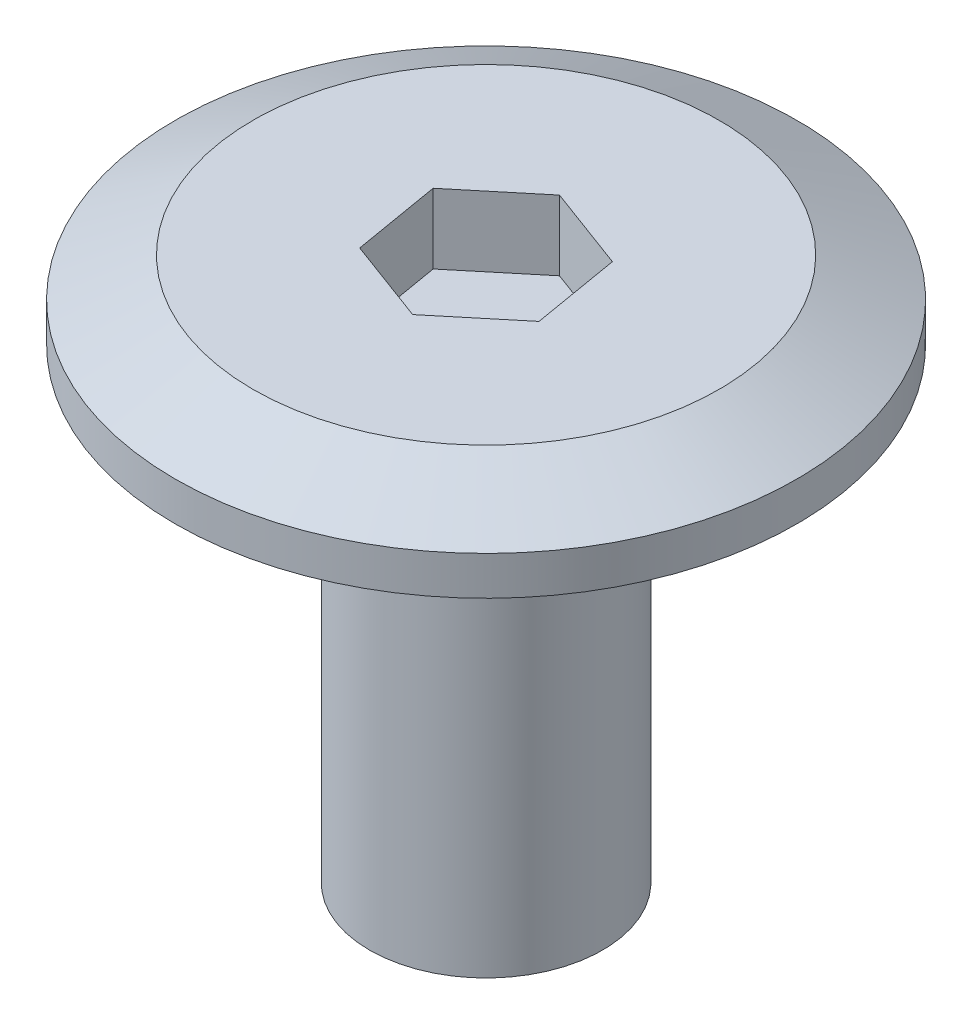
ISO-10303-21;
HEADER;
FILE_DESCRIPTION(('STEP AP214'),'2;1');
FILE_NAME('part.step','',(''),(''),'','','');
FILE_SCHEMA(('AUTOMOTIVE_DESIGN { 1 0 10303 214 1 1 1 1 }'));
ENDSEC;
DATA;
#1=APPLICATION_CONTEXT('core data for automotive mechanical design processes');
#2=APPLICATION_PROTOCOL_DEFINITION('international standard','automotive_design',2000,#1);
#3=PRODUCT_CONTEXT('',#1,'mechanical');
#4=PRODUCT('Part','Part','',(#3));
#5=PRODUCT_RELATED_PRODUCT_CATEGORY('part','',(#4));
#6=PRODUCT_DEFINITION_FORMATION('','',#4);
#7=PRODUCT_DEFINITION_CONTEXT('part definition',#1,'design');
#8=PRODUCT_DEFINITION('design','',#6,#7);
#9=PRODUCT_DEFINITION_SHAPE('','',#8);
#10=(LENGTH_UNIT() NAMED_UNIT(*) SI_UNIT(.MILLI.,.METRE.));
#11=(NAMED_UNIT(*) PLANE_ANGLE_UNIT() SI_UNIT($,.RADIAN.));
#12=(NAMED_UNIT(*) SI_UNIT($,.STERADIAN.) SOLID_ANGLE_UNIT());
#13=UNCERTAINTY_MEASURE_WITH_UNIT(LENGTH_MEASURE(1.E-05),#10,'distance_accuracy_value','');
#14=(GEOMETRIC_REPRESENTATION_CONTEXT(3) GLOBAL_UNCERTAINTY_ASSIGNED_CONTEXT((#13)) GLOBAL_UNIT_ASSIGNED_CONTEXT((#10,
#11,#12)) REPRESENTATION_CONTEXT('',''));
#15=CARTESIAN_POINT('',(0.,0.,0.));
#16=DIRECTION('',(0.,0.,1.));
#17=DIRECTION('',(1.,0.,0.));
#18=AXIS2_PLACEMENT_3D('',#15,#16,#17);
#19=CARTESIAN_POINT('',(0.,0.,0.));
#20=DIRECTION('',(0.,1.,0.));
#21=DIRECTION('',(0.,0.,1.));
#22=AXIS2_PLACEMENT_3D('',#19,#20,#21);
#23=PLANE('',#22);
#24=CARTESIAN_POINT('',(0.,0.,0.));
#25=DIRECTION('',(0.,1.,0.));
#26=DIRECTION('',(0.,0.,1.));
#27=AXIS2_PLACEMENT_3D('',#24,#25,#26);
#28=CIRCLE('',#27,4.);
#29=CARTESIAN_POINT('',(0.,0.,4.));
#30=VERTEX_POINT('',#29);
#31=EDGE_CURVE('E135',#30,#30,#28,.T.);
#32=ORIENTED_EDGE('',*,*,#31,.F.);
#33=EDGE_LOOP('',(#32));
#34=FACE_BOUND('',#33,.T.);
#35=CARTESIAN_POINT('',(0.,0.,0.));
#36=DIRECTION('',(0.,1.,0.));
#37=DIRECTION('',(0.,0.,1.));
#38=AXIS2_PLACEMENT_3D('',#35,#36,#37);
#39=CIRCLE('',#38,1.5);
#40=CARTESIAN_POINT('',(0.,0.,1.5));
#41=VERTEX_POINT('',#40);
#42=EDGE_CURVE('E11',#41,#41,#39,.F.);
#43=ORIENTED_EDGE('',*,*,#42,.F.);
#44=EDGE_LOOP('',(#43));
#45=FACE_BOUND('',#44,.T.);
#46=ADVANCED_FACE('F32',(#34,#45),#23,.F.);
#47=CARTESIAN_POINT('',(0.,1.,0.));
#48=DIRECTION('',(0.,-1.,0.));
#49=DIRECTION('',(0.,0.,-1.));
#50=AXIS2_PLACEMENT_3D('',#47,#48,#49);
#51=CYLINDRICAL_SURFACE('',#50,4.);
#52=CARTESIAN_POINT('',(0.,0.5,0.));
#53=DIRECTION('',(0.,1.,0.));
#54=DIRECTION('',(0.,0.,1.));
#55=AXIS2_PLACEMENT_3D('',#52,#53,#54);
#56=CIRCLE('',#55,4.);
#57=CARTESIAN_POINT('',(0.,0.5,4.));
#58=VERTEX_POINT('',#57);
#59=EDGE_CURVE('E40',#58,#58,#56,.F.);
#60=ORIENTED_EDGE('',*,*,#59,.T.);
#61=EDGE_LOOP('',(#60));
#62=FACE_BOUND('',#61,.T.);
#63=ORIENTED_EDGE('',*,*,#31,.T.);
#64=EDGE_LOOP('',(#63));
#65=FACE_BOUND('',#64,.T.);
#66=ADVANCED_FACE('F148',(#62,#65),#51,.T.);
#67=CARTESIAN_POINT('',(0.,1.,0.));
#68=DIRECTION('',(0.,1.,0.));
#69=DIRECTION('',(0.,0.,1.));
#70=AXIS2_PLACEMENT_3D('',#67,#68,#69);
#71=PLANE('',#70);
#72=DIRECTION('',(-0.167674640500967,0.,-0.985842388484524));
#73=VECTOR('',#72,1.);
#74=CARTESIAN_POINT('',(1.08264938731403,1.,0.401501727869117));
#75=LINE('',#74,#73);
#76=CARTESIAN_POINT('',(1.08264938731403,1.,0.401501727869117));
#77=VERTEX_POINT('',#76);
#78=CARTESIAN_POINT('',(0.889035389655017,1.,-0.73685100887105));
#79=VERTEX_POINT('',#78);
#80=EDGE_CURVE('E47',#77,#79,#75,.T.);
#81=ORIENTED_EDGE('',*,*,#80,.F.);
#82=DIRECTION('',(0.769927232304642,0.,-0.638131692486523));
#83=VECTOR('',#82,1.);
#84=CARTESIAN_POINT('',(0.193613997659014,1.,1.13835273674017));
#85=LINE('',#84,#83);
#86=CARTESIAN_POINT('',(0.193613997659014,1.,1.13835273674017));
#87=VERTEX_POINT('',#86);
#88=EDGE_CURVE('E131',#87,#77,#85,.T.);
#89=ORIENTED_EDGE('',*,*,#88,.F.);
#90=DIRECTION('',(0.937601872805609,0.,0.347710695998002));
#91=VECTOR('',#90,1.);
#92=CARTESIAN_POINT('',(-0.889035389655016,1.,0.736851008871051));
#93=LINE('',#92,#91);
#94=CARTESIAN_POINT('',(-0.889035389655016,1.,0.736851008871051));
#95=VERTEX_POINT('',#94);
#96=EDGE_CURVE('E129',#95,#87,#93,.T.);
#97=ORIENTED_EDGE('',*,*,#96,.F.);
#98=DIRECTION('',(0.167674640500967,0.,0.985842388484524));
#99=VECTOR('',#98,1.);
#100=CARTESIAN_POINT('',(-1.08264938731403,1.,-0.401501727869116));
#101=LINE('',#100,#99);
#102=CARTESIAN_POINT('',(-1.08264938731403,1.,-0.401501727869116));
#103=VERTEX_POINT('',#102);
#104=EDGE_CURVE('E95',#103,#95,#101,.T.);
#105=ORIENTED_EDGE('',*,*,#104,.F.);
#106=DIRECTION('',(-0.769927232304642,0.,0.638131692486523));
#107=VECTOR('',#106,1.);
#108=CARTESIAN_POINT('',(-0.193613997659014,1.,-1.13835273674017));
#109=LINE('',#108,#107);
#110=CARTESIAN_POINT('',(-0.193613997659014,1.,-1.13835273674017));
#111=VERTEX_POINT('',#110);
#112=EDGE_CURVE('E125',#111,#103,#109,.T.);
#113=ORIENTED_EDGE('',*,*,#112,.F.);
#114=DIRECTION('',(-0.937601872805609,0.,-0.347710695998002));
#115=VECTOR('',#114,1.);
#116=CARTESIAN_POINT('',(0.889035389655017,1.,-0.73685100887105));
#117=LINE('',#116,#115);
#118=EDGE_CURVE('E121',#79,#111,#117,.T.);
#119=ORIENTED_EDGE('',*,*,#118,.F.);
#120=EDGE_LOOP('',(#81,#89,#97,#105,#113,#119));
#121=FACE_BOUND('',#120,.T.);
#122=CARTESIAN_POINT('',(0.,1.,0.));
#123=DIRECTION('',(0.,1.,0.));
#124=DIRECTION('',(0.,0.,1.));
#125=AXIS2_PLACEMENT_3D('',#122,#123,#124);
#126=CIRCLE('',#125,2.99999999999999);
#127=CARTESIAN_POINT('',(0.,1.,2.99999999999999));
#128=VERTEX_POINT('',#127);
#129=EDGE_CURVE('E143',#128,#128,#126,.T.);
#130=ORIENTED_EDGE('',*,*,#129,.T.);
#131=EDGE_LOOP('',(#130));
#132=FACE_BOUND('',#131,.T.);
#133=ADVANCED_FACE('F154',(#121,#132),#71,.T.);
#134=CARTESIAN_POINT('',(0.,1.,0.));
#135=DIRECTION('',(0.,-1.,0.));
#136=DIRECTION('',(0.,0.,-1.));
#137=AXIS2_PLACEMENT_3D('',#134,#135,#136);
#138=CONICAL_SURFACE('',#137,2.99999999999999,1.10714871779409);
#139=ORIENTED_EDGE('',*,*,#59,.F.);
#140=EDGE_LOOP('',(#139));
#141=FACE_BOUND('',#140,.T.);
#142=ORIENTED_EDGE('',*,*,#129,.F.);
#143=EDGE_LOOP('',(#142));
#144=FACE_BOUND('',#143,.T.);
#145=ADVANCED_FACE('F34',(#141,#144),#138,.T.);
#146=CARTESIAN_POINT('',(1.08264938731403,0.1,0.401501727869117));
#147=DIRECTION('',(0.985842388484524,0.,-0.167674640500967));
#148=DIRECTION('',(-0.167674640500967,0.,-0.985842388484524));
#149=AXIS2_PLACEMENT_3D('',#146,#147,#148);
#150=PLANE('',#149);
#151=ORIENTED_EDGE('',*,*,#80,.T.);
#152=DIRECTION('',(0.,1.,0.));
#153=VECTOR('',#152,1.);
#154=CARTESIAN_POINT('',(0.889035389655017,0.1,-0.73685100887105));
#155=LINE('',#154,#153);
#156=CARTESIAN_POINT('',(0.889035389655017,0.1,-0.73685100887105));
#157=VERTEX_POINT('',#156);
#158=EDGE_CURVE('E77',#157,#79,#155,.T.);
#159=ORIENTED_EDGE('',*,*,#158,.F.);
#160=DIRECTION('',(-0.167674640500967,0.,-0.985842388484524));
#161=VECTOR('',#160,1.);
#162=CARTESIAN_POINT('',(1.08264938731403,0.1,0.401501727869117));
#163=LINE('',#162,#161);
#164=CARTESIAN_POINT('',(1.08264938731403,0.1,0.401501727869117));
#165=VERTEX_POINT('',#164);
#166=EDGE_CURVE('E133',#165,#157,#163,.T.);
#167=ORIENTED_EDGE('',*,*,#166,.F.);
#168=DIRECTION('',(0.,1.,0.));
#169=VECTOR('',#168,1.);
#170=CARTESIAN_POINT('',(1.08264938731403,0.1,0.401501727869117));
#171=LINE('',#170,#169);
#172=EDGE_CURVE('E55',#165,#77,#171,.T.);
#173=ORIENTED_EDGE('',*,*,#172,.T.);
#174=EDGE_LOOP('',(#151,#159,#167,#173));
#175=FACE_BOUND('',#174,.T.);
#176=ADVANCED_FACE('F153',(#175),#150,.F.);
#177=CARTESIAN_POINT('',(0.193613997659014,0.1,1.13835273674017));
#178=DIRECTION('',(0.638131692486523,0.,0.769927232304642));
#179=DIRECTION('',(0.769927232304642,0.,-0.638131692486523));
#180=AXIS2_PLACEMENT_3D('',#177,#178,#179);
#181=PLANE('',#180);
#182=ORIENTED_EDGE('',*,*,#88,.T.);
#183=ORIENTED_EDGE('',*,*,#172,.F.);
#184=DIRECTION('',(0.769927232304642,0.,-0.638131692486523));
#185=VECTOR('',#184,1.);
#186=CARTESIAN_POINT('',(0.193613997659014,0.1,1.13835273674017));
#187=LINE('',#186,#185);
#188=CARTESIAN_POINT('',(0.193613997659014,0.1,1.13835273674017));
#189=VERTEX_POINT('',#188);
#190=EDGE_CURVE('E107',#189,#165,#187,.T.);
#191=ORIENTED_EDGE('',*,*,#190,.F.);
#192=DIRECTION('',(0.,1.,0.));
#193=VECTOR('',#192,1.);
#194=CARTESIAN_POINT('',(0.193613997659014,0.1,1.13835273674017));
#195=LINE('',#194,#193);
#196=EDGE_CURVE('E99',#189,#87,#195,.T.);
#197=ORIENTED_EDGE('',*,*,#196,.T.);
#198=EDGE_LOOP('',(#182,#183,#191,#197));
#199=FACE_BOUND('',#198,.T.);
#200=ADVANCED_FACE('F188',(#199),#181,.F.);
#201=CARTESIAN_POINT('',(-0.889035389655016,0.1,0.736851008871051));
#202=DIRECTION('',(-0.347710695998002,0.,0.937601872805609));
#203=DIRECTION('',(0.937601872805609,0.,0.347710695998002));
#204=AXIS2_PLACEMENT_3D('',#201,#202,#203);
#205=PLANE('',#204);
#206=ORIENTED_EDGE('',*,*,#96,.T.);
#207=ORIENTED_EDGE('',*,*,#196,.F.);
#208=DIRECTION('',(0.937601872805609,0.,0.347710695998002));
#209=VECTOR('',#208,1.);
#210=CARTESIAN_POINT('',(-0.889035389655016,0.1,0.736851008871051));
#211=LINE('',#210,#209);
#212=CARTESIAN_POINT('',(-0.889035389655016,0.1,0.736851008871051));
#213=VERTEX_POINT('',#212);
#214=EDGE_CURVE('E103',#213,#189,#211,.T.);
#215=ORIENTED_EDGE('',*,*,#214,.F.);
#216=DIRECTION('',(0.,1.,0.));
#217=VECTOR('',#216,1.);
#218=CARTESIAN_POINT('',(-0.889035389655016,0.1,0.736851008871051));
#219=LINE('',#218,#217);
#220=EDGE_CURVE('E88',#213,#95,#219,.T.);
#221=ORIENTED_EDGE('',*,*,#220,.T.);
#222=EDGE_LOOP('',(#206,#207,#215,#221));
#223=FACE_BOUND('',#222,.T.);
#224=ADVANCED_FACE('F104',(#223),#205,.F.);
#225=CARTESIAN_POINT('',(-1.08264938731403,0.1,-0.401501727869116));
#226=DIRECTION('',(-0.985842388484524,0.,0.167674640500967));
#227=DIRECTION('',(0.167674640500967,0.,0.985842388484524));
#228=AXIS2_PLACEMENT_3D('',#225,#226,#227);
#229=PLANE('',#228);
#230=ORIENTED_EDGE('',*,*,#104,.T.);
#231=ORIENTED_EDGE('',*,*,#220,.F.);
#232=DIRECTION('',(0.167674640500967,0.,0.985842388484524));
#233=VECTOR('',#232,1.);
#234=CARTESIAN_POINT('',(-1.08264938731403,0.1,-0.401501727869116));
#235=LINE('',#234,#233);
#236=CARTESIAN_POINT('',(-1.08264938731403,0.1,-0.401501727869116));
#237=VERTEX_POINT('',#236);
#238=EDGE_CURVE('E92',#237,#213,#235,.T.);
#239=ORIENTED_EDGE('',*,*,#238,.F.);
#240=DIRECTION('',(0.,1.,0.));
#241=VECTOR('',#240,1.);
#242=CARTESIAN_POINT('',(-1.08264938731403,0.1,-0.401501727869116));
#243=LINE('',#242,#241);
#244=EDGE_CURVE('E100',#237,#103,#243,.T.);
#245=ORIENTED_EDGE('',*,*,#244,.T.);
#246=EDGE_LOOP('',(#230,#231,#239,#245));
#247=FACE_BOUND('',#246,.T.);
#248=ADVANCED_FACE('F90',(#247),#229,.F.);
#249=CARTESIAN_POINT('',(-0.193613997659014,0.1,-1.13835273674017));
#250=DIRECTION('',(-0.638131692486523,0.,-0.769927232304642));
#251=DIRECTION('',(-0.769927232304642,0.,0.638131692486523));
#252=AXIS2_PLACEMENT_3D('',#249,#250,#251);
#253=PLANE('',#252);
#254=ORIENTED_EDGE('',*,*,#112,.T.);
#255=ORIENTED_EDGE('',*,*,#244,.F.);
#256=DIRECTION('',(-0.769927232304642,0.,0.638131692486523));
#257=VECTOR('',#256,1.);
#258=CARTESIAN_POINT('',(-0.193613997659014,0.1,-1.13835273674017));
#259=LINE('',#258,#257);
#260=CARTESIAN_POINT('',(-0.193613997659014,0.1,-1.13835273674017));
#261=VERTEX_POINT('',#260);
#262=EDGE_CURVE('E113',#261,#237,#259,.T.);
#263=ORIENTED_EDGE('',*,*,#262,.F.);
#264=DIRECTION('',(0.,1.,0.));
#265=VECTOR('',#264,1.);
#266=CARTESIAN_POINT('',(-0.193613997659014,0.1,-1.13835273674017));
#267=LINE('',#266,#265);
#268=EDGE_CURVE('E138',#261,#111,#267,.T.);
#269=ORIENTED_EDGE('',*,*,#268,.T.);
#270=EDGE_LOOP('',(#254,#255,#263,#269));
#271=FACE_BOUND('',#270,.T.);
#272=ADVANCED_FACE('F195',(#271),#253,.F.);
#273=CARTESIAN_POINT('',(0.889035389655017,0.1,-0.73685100887105));
#274=DIRECTION('',(0.347710695998002,0.,-0.937601872805609));
#275=DIRECTION('',(-0.937601872805609,0.,-0.347710695998002));
#276=AXIS2_PLACEMENT_3D('',#273,#274,#275);
#277=PLANE('',#276);
#278=ORIENTED_EDGE('',*,*,#118,.T.);
#279=ORIENTED_EDGE('',*,*,#268,.F.);
#280=DIRECTION('',(-0.937601872805609,0.,-0.347710695998002));
#281=VECTOR('',#280,1.);
#282=CARTESIAN_POINT('',(0.889035389655017,0.1,-0.73685100887105));
#283=LINE('',#282,#281);
#284=EDGE_CURVE('E115',#157,#261,#283,.T.);
#285=ORIENTED_EDGE('',*,*,#284,.F.);
#286=ORIENTED_EDGE('',*,*,#158,.T.);
#287=EDGE_LOOP('',(#278,#279,#285,#286));
#288=FACE_BOUND('',#287,.T.);
#289=ADVANCED_FACE('F184',(#288),#277,.F.);
#290=CARTESIAN_POINT('',(0.,0.1,0.));
#291=DIRECTION('',(0.,1.,0.));
#292=DIRECTION('',(0.,0.,1.));
#293=AXIS2_PLACEMENT_3D('',#290,#291,#292);
#294=PLANE('',#293);
#295=ORIENTED_EDGE('',*,*,#166,.T.);
#296=ORIENTED_EDGE('',*,*,#284,.T.);
#297=ORIENTED_EDGE('',*,*,#262,.T.);
#298=ORIENTED_EDGE('',*,*,#238,.T.);
#299=ORIENTED_EDGE('',*,*,#214,.T.);
#300=ORIENTED_EDGE('',*,*,#190,.T.);
#301=EDGE_LOOP('',(#295,#296,#297,#298,#299,#300));
#302=FACE_BOUND('',#301,.T.);
#303=ADVANCED_FACE('F110',(#302),#294,.T.);
#304=CARTESIAN_POINT('',(0.,-6.,0.));
#305=DIRECTION('',(0.,1.,0.));
#306=DIRECTION('',(0.,0.,1.));
#307=AXIS2_PLACEMENT_3D('',#304,#305,#306);
#308=CYLINDRICAL_SURFACE('',#307,1.5);
#309=CARTESIAN_POINT('',(0.,-6.,0.));
#310=DIRECTION('',(0.,-1.,0.));
#311=DIRECTION('',(0.,0.,-1.));
#312=AXIS2_PLACEMENT_3D('',#309,#310,#311);
#313=CIRCLE('',#312,1.5);
#314=CARTESIAN_POINT('',(0.,-6.,-1.5));
#315=VERTEX_POINT('',#314);
#316=EDGE_CURVE('E122',#315,#315,#313,.T.);
#317=ORIENTED_EDGE('',*,*,#316,.F.);
#318=EDGE_LOOP('',(#317));
#319=FACE_BOUND('',#318,.T.);
#320=ORIENTED_EDGE('',*,*,#42,.T.);
#321=EDGE_LOOP('',(#320));
#322=FACE_BOUND('',#321,.T.);
#323=ADVANCED_FACE('F173',(#319,#322),#308,.T.);
#324=CARTESIAN_POINT('',(0.,-6.,0.));
#325=DIRECTION('',(0.,-1.,0.));
#326=DIRECTION('',(0.,0.,-1.));
#327=AXIS2_PLACEMENT_3D('',#324,#325,#326);
#328=PLANE('',#327);
#329=ORIENTED_EDGE('',*,*,#316,.T.);
#330=EDGE_LOOP('',(#329));
#331=FACE_BOUND('',#330,.T.);
#332=ADVANCED_FACE('F175',(#331),#328,.T.);
#333=CLOSED_SHELL('',(#46,#66,#133,#145,#176,#200,#224,#248,#272,#289,#303,#323,#332));
#334=MANIFOLD_SOLID_BREP('B2',#333);
#335=ADVANCED_BREP_SHAPE_REPRESENTATION('',(#18,#334),#14);
#336=SHAPE_DEFINITION_REPRESENTATION(#9,#335);
ENDSEC;
END-ISO-10303-21;
